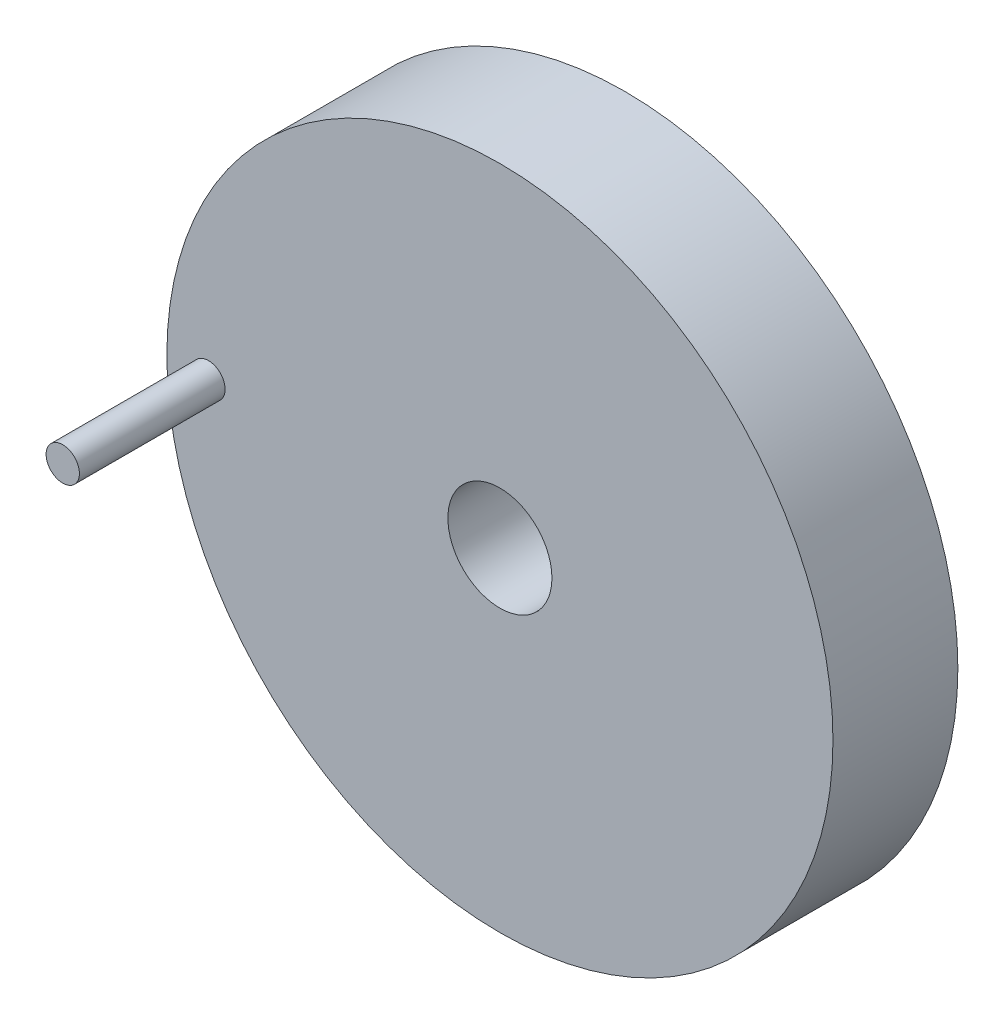
ISO-10303-21;
HEADER;
FILE_DESCRIPTION(('STEP AP214'),'2;1');
FILE_NAME('part.step','',(''),(''),'','','');
FILE_SCHEMA(('AUTOMOTIVE_DESIGN { 1 0 10303 214 1 1 1 1 }'));
ENDSEC;
DATA;
#1=APPLICATION_CONTEXT('core data for automotive mechanical design processes');
#2=APPLICATION_PROTOCOL_DEFINITION('international standard','automotive_design',2000,#1);
#3=PRODUCT_CONTEXT('',#1,'mechanical');
#4=PRODUCT('Part','Part','',(#3));
#5=PRODUCT_RELATED_PRODUCT_CATEGORY('part','',(#4));
#6=PRODUCT_DEFINITION_FORMATION('','',#4);
#7=PRODUCT_DEFINITION_CONTEXT('part definition',#1,'design');
#8=PRODUCT_DEFINITION('design','',#6,#7);
#9=PRODUCT_DEFINITION_SHAPE('','',#8);
#10=(LENGTH_UNIT() NAMED_UNIT(*) SI_UNIT(.MILLI.,.METRE.));
#11=(NAMED_UNIT(*) PLANE_ANGLE_UNIT() SI_UNIT($,.RADIAN.));
#12=(NAMED_UNIT(*) SI_UNIT($,.STERADIAN.) SOLID_ANGLE_UNIT());
#13=UNCERTAINTY_MEASURE_WITH_UNIT(LENGTH_MEASURE(1.E-05),#10,'distance_accuracy_value','');
#14=(GEOMETRIC_REPRESENTATION_CONTEXT(3) GLOBAL_UNCERTAINTY_ASSIGNED_CONTEXT((#13)) GLOBAL_UNIT_ASSIGNED_CONTEXT((#10,
#11,#12)) REPRESENTATION_CONTEXT('',''));
#15=CARTESIAN_POINT('',(0.,0.,0.));
#16=DIRECTION('',(0.,0.,1.));
#17=DIRECTION('',(1.,0.,0.));
#18=AXIS2_PLACEMENT_3D('',#15,#16,#17);
#19=CARTESIAN_POINT('',(0.,0.,-30.));
#20=DIRECTION('',(0.,0.,1.));
#21=DIRECTION('',(1.,0.,0.));
#22=AXIS2_PLACEMENT_3D('',#19,#20,#21);
#23=CYLINDRICAL_SURFACE('',#22,80.);
#24=CARTESIAN_POINT('',(0.,0.,-30.));
#25=DIRECTION('',(0.,0.,1.));
#26=DIRECTION('',(1.,0.,0.));
#27=AXIS2_PLACEMENT_3D('',#24,#25,#26);
#28=CIRCLE('',#27,80.);
#29=CARTESIAN_POINT('',(80.,0.,-30.));
#30=VERTEX_POINT('',#29);
#31=EDGE_CURVE('E10',#30,#30,#28,.T.);
#32=ORIENTED_EDGE('',*,*,#31,.T.);
#33=EDGE_LOOP('',(#32));
#34=FACE_BOUND('',#33,.T.);
#35=CARTESIAN_POINT('',(0.,0.,0.));
#36=DIRECTION('',(0.,0.,1.));
#37=DIRECTION('',(1.,0.,0.));
#38=AXIS2_PLACEMENT_3D('',#35,#36,#37);
#39=CIRCLE('',#38,80.);
#40=CARTESIAN_POINT('',(80.,0.,0.));
#41=VERTEX_POINT('',#40);
#42=EDGE_CURVE('E40',#41,#41,#39,.T.);
#43=ORIENTED_EDGE('',*,*,#42,.F.);
#44=EDGE_LOOP('',(#43));
#45=FACE_BOUND('',#44,.T.);
#46=ADVANCED_FACE('F37',(#34,#45),#23,.T.);
#47=CARTESIAN_POINT('',(0.,0.,-30.));
#48=DIRECTION('',(0.,0.,1.));
#49=DIRECTION('',(1.,0.,0.));
#50=AXIS2_PLACEMENT_3D('',#47,#48,#49);
#51=PLANE('',#50);
#52=CARTESIAN_POINT('',(0.,0.,-30.));
#53=DIRECTION('',(0.,0.,1.));
#54=DIRECTION('',(1.,0.,0.));
#55=AXIS2_PLACEMENT_3D('',#52,#53,#54);
#56=CIRCLE('',#55,12.5);
#57=CARTESIAN_POINT('',(12.5,0.,-30.));
#58=VERTEX_POINT('',#57);
#59=EDGE_CURVE('E49',#58,#58,#56,.T.);
#60=ORIENTED_EDGE('',*,*,#59,.T.);
#61=EDGE_LOOP('',(#60));
#62=FACE_BOUND('',#61,.T.);
#63=ORIENTED_EDGE('',*,*,#31,.F.);
#64=EDGE_LOOP('',(#63));
#65=FACE_BOUND('',#64,.T.);
#66=ADVANCED_FACE('F79',(#62,#65),#51,.F.);
#67=CARTESIAN_POINT('',(0.,0.,0.));
#68=DIRECTION('',(0.,0.,1.));
#69=DIRECTION('',(1.,0.,0.));
#70=AXIS2_PLACEMENT_3D('',#67,#68,#69);
#71=PLANE('',#70);
#72=CARTESIAN_POINT('',(-70.,0.,0.));
#73=DIRECTION('',(0.,0.,1.));
#74=DIRECTION('',(1.,0.,0.));
#75=AXIS2_PLACEMENT_3D('',#72,#73,#74);
#76=CIRCLE('',#75,4.00000000000001);
#77=CARTESIAN_POINT('',(-66.,0.,0.));
#78=VERTEX_POINT('',#77);
#79=EDGE_CURVE('E59',#78,#78,#76,.T.);
#80=ORIENTED_EDGE('',*,*,#79,.F.);
#81=EDGE_LOOP('',(#80));
#82=FACE_BOUND('',#81,.T.);
#83=CARTESIAN_POINT('',(0.,0.,0.));
#84=DIRECTION('',(0.,0.,1.));
#85=DIRECTION('',(1.,0.,0.));
#86=AXIS2_PLACEMENT_3D('',#83,#84,#85);
#87=CIRCLE('',#86,12.5);
#88=CARTESIAN_POINT('',(12.5,0.,0.));
#89=VERTEX_POINT('',#88);
#90=EDGE_CURVE('E51',#89,#89,#87,.T.);
#91=ORIENTED_EDGE('',*,*,#90,.F.);
#92=EDGE_LOOP('',(#91));
#93=FACE_BOUND('',#92,.T.);
#94=ORIENTED_EDGE('',*,*,#42,.T.);
#95=EDGE_LOOP('',(#94));
#96=FACE_BOUND('',#95,.T.);
#97=ADVANCED_FACE('F76',(#82,#93,#96),#71,.T.);
#98=CARTESIAN_POINT('',(0.,0.,-30.));
#99=DIRECTION('',(0.,0.,1.));
#100=DIRECTION('',(1.,0.,0.));
#101=AXIS2_PLACEMENT_3D('',#98,#99,#100);
#102=CYLINDRICAL_SURFACE('',#101,12.5);
#103=ORIENTED_EDGE('',*,*,#59,.F.);
#104=EDGE_LOOP('',(#103));
#105=FACE_BOUND('',#104,.T.);
#106=ORIENTED_EDGE('',*,*,#90,.T.);
#107=EDGE_LOOP('',(#106));
#108=FACE_BOUND('',#107,.T.);
#109=ADVANCED_FACE('F72',(#105,#108),#102,.F.);
#110=CARTESIAN_POINT('',(-70.,0.,35.));
#111=DIRECTION('',(0.,0.,-1.));
#112=DIRECTION('',(-1.,0.,0.));
#113=AXIS2_PLACEMENT_3D('',#110,#111,#112);
#114=CYLINDRICAL_SURFACE('',#113,4.00000000000001);
#115=CARTESIAN_POINT('',(-70.,0.,35.));
#116=DIRECTION('',(0.,0.,1.));
#117=DIRECTION('',(1.,0.,0.));
#118=AXIS2_PLACEMENT_3D('',#115,#116,#117);
#119=CIRCLE('',#118,4.00000000000001);
#120=CARTESIAN_POINT('',(-66.,0.,35.));
#121=VERTEX_POINT('',#120);
#122=EDGE_CURVE('E55',#121,#121,#119,.T.);
#123=ORIENTED_EDGE('',*,*,#122,.F.);
#124=EDGE_LOOP('',(#123));
#125=FACE_BOUND('',#124,.T.);
#126=ORIENTED_EDGE('',*,*,#79,.T.);
#127=EDGE_LOOP('',(#126));
#128=FACE_BOUND('',#127,.T.);
#129=ADVANCED_FACE('F69',(#125,#128),#114,.T.);
#130=CARTESIAN_POINT('',(-70.,0.,35.));
#131=DIRECTION('',(0.,0.,1.));
#132=DIRECTION('',(1.,0.,0.));
#133=AXIS2_PLACEMENT_3D('',#130,#131,#132);
#134=PLANE('',#133);
#135=ORIENTED_EDGE('',*,*,#122,.T.);
#136=EDGE_LOOP('',(#135));
#137=FACE_BOUND('',#136,.T.);
#138=ADVANCED_FACE('F67',(#137),#134,.T.);
#139=CLOSED_SHELL('',(#46,#66,#97,#109,#129,#138));
#140=MANIFOLD_SOLID_BREP('B2',#139);
#141=ADVANCED_BREP_SHAPE_REPRESENTATION('',(#18,#140),#14);
#142=SHAPE_DEFINITION_REPRESENTATION(#9,#141);
ENDSEC;
END-ISO-10303-21;
